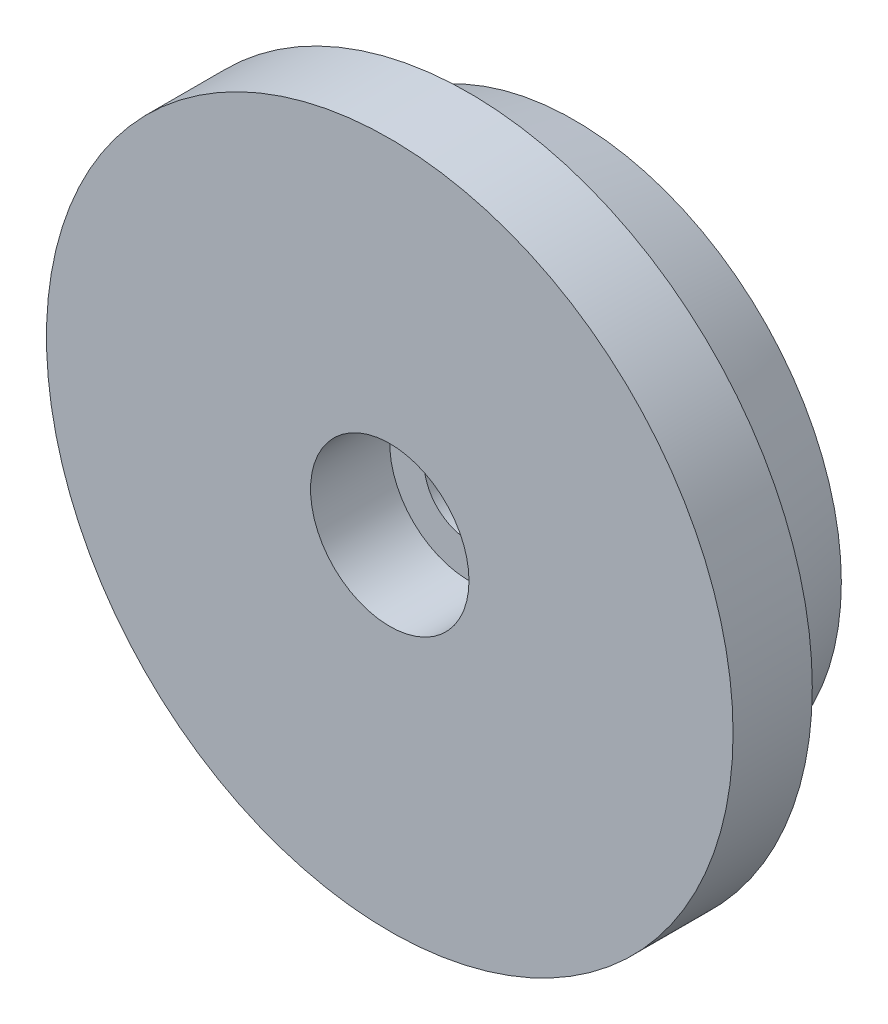
ISO-10303-21;
HEADER;
FILE_DESCRIPTION(('STEP AP214'),'2;1');
FILE_NAME('part.step','',(''),(''),'','','');
FILE_SCHEMA(('AUTOMOTIVE_DESIGN { 1 0 10303 214 1 1 1 1 }'));
ENDSEC;
DATA;
#1=APPLICATION_CONTEXT('core data for automotive mechanical design processes');
#2=APPLICATION_PROTOCOL_DEFINITION('international standard','automotive_design',2000,#1);
#3=PRODUCT_CONTEXT('',#1,'mechanical');
#4=PRODUCT('Part','Part','',(#3));
#5=PRODUCT_RELATED_PRODUCT_CATEGORY('part','',(#4));
#6=PRODUCT_DEFINITION_FORMATION('','',#4);
#7=PRODUCT_DEFINITION_CONTEXT('part definition',#1,'design');
#8=PRODUCT_DEFINITION('design','',#6,#7);
#9=PRODUCT_DEFINITION_SHAPE('','',#8);
#10=(LENGTH_UNIT() NAMED_UNIT(*) SI_UNIT(.MILLI.,.METRE.));
#11=(NAMED_UNIT(*) PLANE_ANGLE_UNIT() SI_UNIT($,.RADIAN.));
#12=(NAMED_UNIT(*) SI_UNIT($,.STERADIAN.) SOLID_ANGLE_UNIT());
#13=UNCERTAINTY_MEASURE_WITH_UNIT(LENGTH_MEASURE(1.E-05),#10,'distance_accuracy_value','');
#14=(GEOMETRIC_REPRESENTATION_CONTEXT(3) GLOBAL_UNCERTAINTY_ASSIGNED_CONTEXT((#13)) GLOBAL_UNIT_ASSIGNED_CONTEXT((#10,
#11,#12)) REPRESENTATION_CONTEXT('',''));
#15=CARTESIAN_POINT('',(0.,0.,0.));
#16=DIRECTION('',(0.,0.,1.));
#17=DIRECTION('',(1.,0.,0.));
#18=AXIS2_PLACEMENT_3D('',#15,#16,#17);
#19=CARTESIAN_POINT('',(132.499999993866,-6.08416095282394E-10,3.));
#20=DIRECTION('',(0.,0.,1.));
#21=DIRECTION('',(1.,0.,0.));
#22=AXIS2_PLACEMENT_3D('',#19,#20,#21);
#23=PLANE('',#22);
#24=CARTESIAN_POINT('',(132.499999993866,-6.08416095282394E-10,3.));
#25=DIRECTION('',(0.,0.,1.));
#26=DIRECTION('',(1.,0.,0.));
#27=AXIS2_PLACEMENT_3D('',#24,#25,#26);
#28=CIRCLE('',#27,13.);
#29=CARTESIAN_POINT('',(145.499999993866,-6.08416095282394E-10,3.));
#30=VERTEX_POINT('',#29);
#31=EDGE_CURVE('E41',#30,#30,#28,.T.);
#32=ORIENTED_EDGE('',*,*,#31,.T.);
#33=EDGE_LOOP('',(#32));
#34=FACE_BOUND('',#33,.T.);
#35=CARTESIAN_POINT('',(132.499999993866,-6.08416095282394E-10,3.));
#36=DIRECTION('',(0.,0.,1.));
#37=DIRECTION('',(1.,0.,0.));
#38=AXIS2_PLACEMENT_3D('',#35,#36,#37);
#39=CIRCLE('',#38,2.99999999999999);
#40=CARTESIAN_POINT('',(135.499999993866,-6.08416095282394E-10,3.));
#41=VERTEX_POINT('',#40);
#42=EDGE_CURVE('E52',#41,#41,#39,.T.);
#43=ORIENTED_EDGE('',*,*,#42,.F.);
#44=EDGE_LOOP('',(#43));
#45=FACE_BOUND('',#44,.T.);
#46=ADVANCED_FACE('F30',(#34,#45),#23,.T.);
#47=CARTESIAN_POINT('',(132.499999993866,-6.08416095282394E-10,0.));
#48=DIRECTION('',(0.,0.,1.));
#49=DIRECTION('',(1.,0.,0.));
#50=AXIS2_PLACEMENT_3D('',#47,#48,#49);
#51=PLANE('',#50);
#52=CARTESIAN_POINT('',(132.500000000113,2.36451136448323E-11,0.));
#53=DIRECTION('',(0.,0.,-1.));
#54=DIRECTION('',(-1.,0.,0.));
#55=AXIS2_PLACEMENT_3D('',#52,#53,#54);
#56=CIRCLE('',#55,11.1);
#57=CARTESIAN_POINT('',(121.400000000113,2.36451136448323E-11,0.));
#58=VERTEX_POINT('',#57);
#59=EDGE_CURVE('E37',#58,#58,#56,.T.);
#60=ORIENTED_EDGE('',*,*,#59,.F.);
#61=EDGE_LOOP('',(#60));
#62=FACE_BOUND('',#61,.T.);
#63=CARTESIAN_POINT('',(132.499999993866,-6.08416095282394E-10,0.));
#64=DIRECTION('',(0.,0.,1.));
#65=DIRECTION('',(1.,0.,0.));
#66=AXIS2_PLACEMENT_3D('',#63,#64,#65);
#67=CIRCLE('',#66,13.);
#68=CARTESIAN_POINT('',(145.499999993866,-6.08416095282394E-10,0.));
#69=VERTEX_POINT('',#68);
#70=EDGE_CURVE('E46',#69,#69,#67,.T.);
#71=ORIENTED_EDGE('',*,*,#70,.F.);
#72=EDGE_LOOP('',(#71));
#73=FACE_BOUND('',#72,.T.);
#74=ADVANCED_FACE('F63',(#62,#73),#51,.F.);
#75=CARTESIAN_POINT('',(132.499999993866,-6.08416095282394E-10,3.));
#76=DIRECTION('',(0.,0.,-1.));
#77=DIRECTION('',(-1.,0.,0.));
#78=AXIS2_PLACEMENT_3D('',#75,#76,#77);
#79=CYLINDRICAL_SURFACE('',#78,13.);
#80=ORIENTED_EDGE('',*,*,#31,.F.);
#81=EDGE_LOOP('',(#80));
#82=FACE_BOUND('',#81,.T.);
#83=ORIENTED_EDGE('',*,*,#70,.T.);
#84=EDGE_LOOP('',(#83));
#85=FACE_BOUND('',#84,.T.);
#86=ADVANCED_FACE('F61',(#82,#85),#79,.T.);
#87=CARTESIAN_POINT('',(132.499999993866,-6.08416095282394E-10,3.));
#88=DIRECTION('',(0.,0.,-1.));
#89=DIRECTION('',(-1.,0.,0.));
#90=AXIS2_PLACEMENT_3D('',#87,#88,#89);
#91=CYLINDRICAL_SURFACE('',#90,2.99999999999999);
#92=ORIENTED_EDGE('',*,*,#42,.T.);
#93=EDGE_LOOP('',(#92));
#94=FACE_BOUND('',#93,.T.);
#95=CARTESIAN_POINT('',(132.499999993866,-6.08416095282394E-10,0.));
#96=DIRECTION('',(0.,0.,1.));
#97=DIRECTION('',(1.,0.,0.));
#98=AXIS2_PLACEMENT_3D('',#95,#96,#97);
#99=CIRCLE('',#98,2.99999999999999);
#100=CARTESIAN_POINT('',(135.499999993866,-6.08416095282394E-10,0.));
#101=VERTEX_POINT('',#100);
#102=EDGE_CURVE('E55',#101,#101,#99,.T.);
#103=ORIENTED_EDGE('',*,*,#102,.F.);
#104=EDGE_LOOP('',(#103));
#105=FACE_BOUND('',#104,.T.);
#106=ADVANCED_FACE('F71',(#94,#105),#91,.F.);
#107=CARTESIAN_POINT('',(132.500000000113,2.36451136448323E-11,0.));
#108=DIRECTION('',(0.,0.,-1.));
#109=DIRECTION('',(-1.,0.,0.));
#110=AXIS2_PLACEMENT_3D('',#107,#108,#109);
#111=PLANE('',#110);
#112=CARTESIAN_POINT('',(132.500000000113,2.36451136448323E-11,0.));
#113=DIRECTION('',(0.,0.,-1.));
#114=DIRECTION('',(-1.,0.,0.));
#115=AXIS2_PLACEMENT_3D('',#112,#113,#114);
#116=CIRCLE('',#115,1.70000000000001);
#117=CARTESIAN_POINT('',(130.800000000113,2.36451136448323E-11,0.));
#118=VERTEX_POINT('',#117);
#119=EDGE_CURVE('E50',#118,#118,#116,.T.);
#120=ORIENTED_EDGE('',*,*,#119,.T.);
#121=EDGE_LOOP('',(#120));
#122=FACE_BOUND('',#121,.T.);
#123=ORIENTED_EDGE('',*,*,#102,.T.);
#124=EDGE_LOOP('',(#123));
#125=FACE_BOUND('',#124,.T.);
#126=ADVANCED_FACE('F78',(#122,#125),#111,.F.);
#127=CARTESIAN_POINT('',(132.500000000113,2.36451136448323E-11,-4.));
#128=DIRECTION('',(0.,0.,-1.));
#129=DIRECTION('',(-1.,0.,0.));
#130=AXIS2_PLACEMENT_3D('',#127,#128,#129);
#131=PLANE('',#130);
#132=CARTESIAN_POINT('',(132.500000000113,2.36451136448323E-11,-4.));
#133=DIRECTION('',(0.,0.,-1.));
#134=DIRECTION('',(-1.,0.,0.));
#135=AXIS2_PLACEMENT_3D('',#132,#133,#134);
#136=CIRCLE('',#135,10.1);
#137=CARTESIAN_POINT('',(122.400000000113,2.36451136448323E-11,-4.));
#138=VERTEX_POINT('',#137);
#139=EDGE_CURVE('E10',#138,#138,#136,.T.);
#140=ORIENTED_EDGE('',*,*,#139,.T.);
#141=EDGE_LOOP('',(#140));
#142=FACE_BOUND('',#141,.T.);
#143=CARTESIAN_POINT('',(132.500000000113,2.36451136448323E-11,-4.));
#144=DIRECTION('',(0.,0.,-1.));
#145=DIRECTION('',(-1.,0.,0.));
#146=AXIS2_PLACEMENT_3D('',#143,#144,#145);
#147=CIRCLE('',#146,1.70000000000001);
#148=CARTESIAN_POINT('',(130.800000000113,2.36451136448323E-11,-4.));
#149=VERTEX_POINT('',#148);
#150=EDGE_CURVE('E57',#149,#149,#147,.T.);
#151=ORIENTED_EDGE('',*,*,#150,.F.);
#152=EDGE_LOOP('',(#151));
#153=FACE_BOUND('',#152,.T.);
#154=ADVANCED_FACE('F82',(#142,#153),#131,.T.);
#155=CARTESIAN_POINT('',(132.500000000113,2.36451136448323E-11,-4.));
#156=DIRECTION('',(0.,0.,1.));
#157=DIRECTION('',(1.,0.,0.));
#158=AXIS2_PLACEMENT_3D('',#155,#156,#157);
#159=CYLINDRICAL_SURFACE('',#158,1.70000000000001);
#160=ORIENTED_EDGE('',*,*,#150,.T.);
#161=EDGE_LOOP('',(#160));
#162=FACE_BOUND('',#161,.T.);
#163=ORIENTED_EDGE('',*,*,#119,.F.);
#164=EDGE_LOOP('',(#163));
#165=FACE_BOUND('',#164,.T.);
#166=ADVANCED_FACE('F86',(#162,#165),#159,.F.);
#167=CARTESIAN_POINT('',(132.500000000113,2.36451136448323E-11,-4.));
#168=DIRECTION('',(0.,0.,1.));
#169=DIRECTION('',(1.,0.,0.));
#170=AXIS2_PLACEMENT_3D('',#167,#168,#169);
#171=CONICAL_SURFACE('',#170,10.1,0.244978663126857);
#172=ORIENTED_EDGE('',*,*,#59,.T.);
#173=EDGE_LOOP('',(#172));
#174=FACE_BOUND('',#173,.T.);
#175=ORIENTED_EDGE('',*,*,#139,.F.);
#176=EDGE_LOOP('',(#175));
#177=FACE_BOUND('',#176,.T.);
#178=ADVANCED_FACE('F32',(#174,#177),#171,.T.);
#179=CLOSED_SHELL('',(#46,#74,#86,#106,#126,#154,#166,#178));
#180=MANIFOLD_SOLID_BREP('B2',#179);
#181=ADVANCED_BREP_SHAPE_REPRESENTATION('',(#18,#180),#14);
#182=SHAPE_DEFINITION_REPRESENTATION(#9,#181);
ENDSEC;
END-ISO-10303-21;
